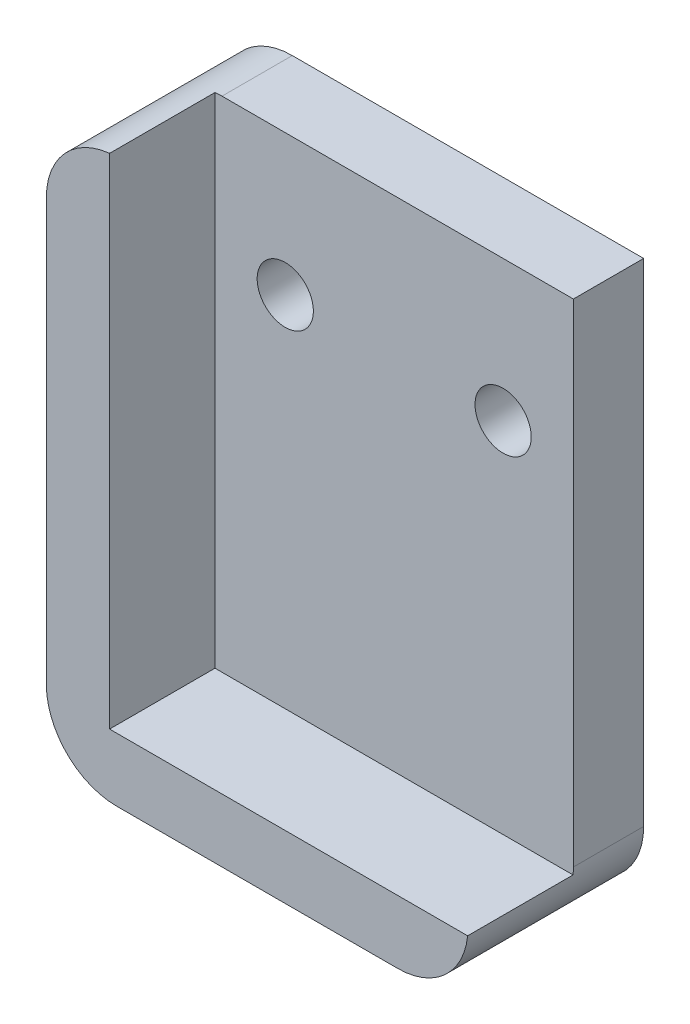
ISO-10303-21;
HEADER;
FILE_DESCRIPTION(('STEP AP214'),'2;1');
FILE_NAME('part.step','',(''),(''),'','','');
FILE_SCHEMA(('AUTOMOTIVE_DESIGN { 1 0 10303 214 1 1 1 1 }'));
ENDSEC;
DATA;
#1=APPLICATION_CONTEXT('core data for automotive mechanical design processes');
#2=APPLICATION_PROTOCOL_DEFINITION('international standard','automotive_design',2000,#1);
#3=PRODUCT_CONTEXT('',#1,'mechanical');
#4=PRODUCT('Part','Part','',(#3));
#5=PRODUCT_RELATED_PRODUCT_CATEGORY('part','',(#4));
#6=PRODUCT_DEFINITION_FORMATION('','',#4);
#7=PRODUCT_DEFINITION_CONTEXT('part definition',#1,'design');
#8=PRODUCT_DEFINITION('design','',#6,#7);
#9=PRODUCT_DEFINITION_SHAPE('','',#8);
#10=(LENGTH_UNIT() NAMED_UNIT(*) SI_UNIT(.MILLI.,.METRE.));
#11=(NAMED_UNIT(*) PLANE_ANGLE_UNIT() SI_UNIT($,.RADIAN.));
#12=(NAMED_UNIT(*) SI_UNIT($,.STERADIAN.) SOLID_ANGLE_UNIT());
#13=UNCERTAINTY_MEASURE_WITH_UNIT(LENGTH_MEASURE(1.E-05),#10,'distance_accuracy_value','');
#14=(GEOMETRIC_REPRESENTATION_CONTEXT(3) GLOBAL_UNCERTAINTY_ASSIGNED_CONTEXT((#13)) GLOBAL_UNIT_ASSIGNED_CONTEXT((#10,
#11,#12)) REPRESENTATION_CONTEXT('',''));
#15=CARTESIAN_POINT('',(0.,0.,0.));
#16=DIRECTION('',(0.,0.,1.));
#17=DIRECTION('',(1.,0.,0.));
#18=AXIS2_PLACEMENT_3D('',#15,#16,#17);
#19=CARTESIAN_POINT('',(60.,0.,10.));
#20=DIRECTION('',(1.,0.,0.));
#21=DIRECTION('',(0.,1.,0.));
#22=AXIS2_PLACEMENT_3D('',#19,#20,#21);
#23=PLANE('',#22);
#24=DIRECTION('',(0.,-1.,0.));
#25=VECTOR('',#24,1.);
#26=CARTESIAN_POINT('',(60.,0.,10.));
#27=LINE('',#26,#25);
#28=CARTESIAN_POINT('',(60.,80.,10.));
#29=VERTEX_POINT('',#28);
#30=CARTESIAN_POINT('',(60.,10.,10.));
#31=VERTEX_POINT('',#30);
#32=EDGE_CURVE('E153',#29,#31,#27,.T.);
#33=ORIENTED_EDGE('',*,*,#32,.T.);
#34=DIRECTION('',(0.,0.,-1.));
#35=VECTOR('',#34,1.);
#36=CARTESIAN_POINT('',(60.,10.,0.));
#37=LINE('',#36,#35);
#38=CARTESIAN_POINT('',(60.,10.,0.));
#39=VERTEX_POINT('',#38);
#40=EDGE_CURVE('E177',#31,#39,#37,.T.);
#41=ORIENTED_EDGE('',*,*,#40,.T.);
#42=DIRECTION('',(0.,-1.,0.));
#43=VECTOR('',#42,1.);
#44=CARTESIAN_POINT('',(60.,0.,0.));
#45=LINE('',#44,#43);
#46=CARTESIAN_POINT('',(60.,80.,0.));
#47=VERTEX_POINT('',#46);
#48=EDGE_CURVE('E152',#47,#39,#45,.T.);
#49=ORIENTED_EDGE('',*,*,#48,.F.);
#50=DIRECTION('',(0.,0.,-1.));
#51=VECTOR('',#50,1.);
#52=CARTESIAN_POINT('',(60.,80.,10.));
#53=LINE('',#52,#51);
#54=EDGE_CURVE('E159',#29,#47,#53,.T.);
#55=ORIENTED_EDGE('',*,*,#54,.F.);
#56=EDGE_LOOP('',(#33,#41,#49,#55));
#57=FACE_BOUND('',#56,.T.);
#58=ADVANCED_FACE('F39',(#57),#23,.T.);
#59=CARTESIAN_POINT('',(0.,80.,10.));
#60=DIRECTION('',(0.,1.,0.));
#61=DIRECTION('',(0.,0.,1.));
#62=AXIS2_PLACEMENT_3D('',#59,#60,#61);
#63=PLANE('',#62);
#64=DIRECTION('',(1.,0.,0.));
#65=VECTOR('',#64,1.);
#66=CARTESIAN_POINT('',(0.,80.,0.));
#67=LINE('',#66,#65);
#68=CARTESIAN_POINT('',(10.,80.,0.));
#69=VERTEX_POINT('',#68);
#70=EDGE_CURVE('E162',#69,#47,#67,.T.);
#71=ORIENTED_EDGE('',*,*,#70,.F.);
#72=DIRECTION('',(0.,0.,-1.));
#73=VECTOR('',#72,1.);
#74=CARTESIAN_POINT('',(10.,80.,10.));
#75=LINE('',#74,#73);
#76=CARTESIAN_POINT('',(10.,80.,10.));
#77=VERTEX_POINT('',#76);
#78=EDGE_CURVE('E47',#69,#77,#75,.F.);
#79=ORIENTED_EDGE('',*,*,#78,.T.);
#80=DIRECTION('',(1.,0.,0.));
#81=VECTOR('',#80,1.);
#82=CARTESIAN_POINT('',(0.,80.,10.));
#83=LINE('',#82,#81);
#84=EDGE_CURVE('E156',#77,#29,#83,.T.);
#85=ORIENTED_EDGE('',*,*,#84,.T.);
#86=ORIENTED_EDGE('',*,*,#54,.T.);
#87=EDGE_LOOP('',(#71,#79,#85,#86));
#88=FACE_BOUND('',#87,.T.);
#89=ADVANCED_FACE('F238',(#88),#63,.T.);
#90=CARTESIAN_POINT('',(0.,0.,10.));
#91=DIRECTION('',(-1.,0.,0.));
#92=DIRECTION('',(0.,0.,1.));
#93=AXIS2_PLACEMENT_3D('',#90,#91,#92);
#94=PLANE('',#93);
#95=DIRECTION('',(0.,1.,0.));
#96=VECTOR('',#95,1.);
#97=CARTESIAN_POINT('',(0.,0.,25.));
#98=LINE('',#97,#96);
#99=CARTESIAN_POINT('',(0.,10.,25.));
#100=VERTEX_POINT('',#99);
#101=CARTESIAN_POINT('',(0.,70.,25.));
#102=VERTEX_POINT('',#101);
#103=EDGE_CURVE('E124',#100,#102,#98,.T.);
#104=ORIENTED_EDGE('',*,*,#103,.T.);
#105=DIRECTION('',(0.,0.,-1.));
#106=VECTOR('',#105,1.);
#107=CARTESIAN_POINT('',(0.,70.,10.));
#108=LINE('',#107,#106);
#109=CARTESIAN_POINT('',(0.,70.,0.));
#110=VERTEX_POINT('',#109);
#111=EDGE_CURVE('E203',#102,#110,#108,.T.);
#112=ORIENTED_EDGE('',*,*,#111,.T.);
#113=DIRECTION('',(0.,1.,0.));
#114=VECTOR('',#113,1.);
#115=CARTESIAN_POINT('',(0.,0.,0.));
#116=LINE('',#115,#114);
#117=CARTESIAN_POINT('',(0.,10.,0.));
#118=VERTEX_POINT('',#117);
#119=EDGE_CURVE('E164',#118,#110,#116,.T.);
#120=ORIENTED_EDGE('',*,*,#119,.F.);
#121=DIRECTION('',(0.,0.,-1.));
#122=VECTOR('',#121,1.);
#123=CARTESIAN_POINT('',(0.,10.,25.));
#124=LINE('',#123,#122);
#125=EDGE_CURVE('E201',#118,#100,#124,.F.);
#126=ORIENTED_EDGE('',*,*,#125,.T.);
#127=EDGE_LOOP('',(#104,#112,#120,#126));
#128=FACE_BOUND('',#127,.T.);
#129=ADVANCED_FACE('F208',(#128),#94,.T.);
#130=CARTESIAN_POINT('',(0.,0.,10.));
#131=DIRECTION('',(0.,1.,0.));
#132=DIRECTION('',(0.,0.,1.));
#133=AXIS2_PLACEMENT_3D('',#130,#131,#132);
#134=PLANE('',#133);
#135=DIRECTION('',(1.,0.,0.));
#136=VECTOR('',#135,1.);
#137=CARTESIAN_POINT('',(0.,0.,0.));
#138=LINE('',#137,#136);
#139=CARTESIAN_POINT('',(10.,0.,0.));
#140=VERTEX_POINT('',#139);
#141=CARTESIAN_POINT('',(50.,0.,0.));
#142=VERTEX_POINT('',#141);
#143=EDGE_CURVE('E157',#140,#142,#138,.T.);
#144=ORIENTED_EDGE('',*,*,#143,.T.);
#145=DIRECTION('',(0.,0.,-1.));
#146=VECTOR('',#145,1.);
#147=CARTESIAN_POINT('',(50.,0.,25.));
#148=LINE('',#147,#146);
#149=CARTESIAN_POINT('',(50.,0.,25.));
#150=VERTEX_POINT('',#149);
#151=EDGE_CURVE('E189',#142,#150,#148,.F.);
#152=ORIENTED_EDGE('',*,*,#151,.T.);
#153=DIRECTION('',(1.,0.,0.));
#154=VECTOR('',#153,1.);
#155=CARTESIAN_POINT('',(0.,0.,25.));
#156=LINE('',#155,#154);
#157=CARTESIAN_POINT('',(10.,0.,25.));
#158=VERTEX_POINT('',#157);
#159=EDGE_CURVE('E134',#158,#150,#156,.T.);
#160=ORIENTED_EDGE('',*,*,#159,.F.);
#161=DIRECTION('',(0.,0.,-1.));
#162=VECTOR('',#161,1.);
#163=CARTESIAN_POINT('',(10.,0.,0.));
#164=LINE('',#163,#162);
#165=EDGE_CURVE('E186',#158,#140,#164,.T.);
#166=ORIENTED_EDGE('',*,*,#165,.T.);
#167=EDGE_LOOP('',(#144,#152,#160,#166));
#168=FACE_BOUND('',#167,.T.);
#169=ADVANCED_FACE('F221',(#168),#134,.F.);
#170=CARTESIAN_POINT('',(0.,0.,10.));
#171=DIRECTION('',(0.,0.,1.));
#172=DIRECTION('',(1.,0.,0.));
#173=AXIS2_PLACEMENT_3D('',#170,#171,#172);
#174=PLANE('',#173);
#175=CARTESIAN_POINT('',(50.,60.,10.));
#176=DIRECTION('',(0.,0.,1.));
#177=DIRECTION('',(1.,0.,0.));
#178=AXIS2_PLACEMENT_3D('',#175,#176,#177);
#179=CIRCLE('',#178,4.00000000000001);
#180=CARTESIAN_POINT('',(54.,60.,10.));
#181=VERTEX_POINT('',#180);
#182=EDGE_CURVE('E140',#181,#181,#179,.F.);
#183=ORIENTED_EDGE('',*,*,#182,.T.);
#184=EDGE_LOOP('',(#183));
#185=FACE_BOUND('',#184,.T.);
#186=CARTESIAN_POINT('',(19.,60.,10.));
#187=DIRECTION('',(0.,0.,1.));
#188=DIRECTION('',(1.,0.,0.));
#189=AXIS2_PLACEMENT_3D('',#186,#187,#188);
#190=CIRCLE('',#189,3.99999999999999);
#191=CARTESIAN_POINT('',(23.,60.,10.));
#192=VERTEX_POINT('',#191);
#193=EDGE_CURVE('E143',#192,#192,#190,.F.);
#194=ORIENTED_EDGE('',*,*,#193,.T.);
#195=EDGE_LOOP('',(#194));
#196=FACE_BOUND('',#195,.T.);
#197=DIRECTION('',(-1.,0.,0.));
#198=VECTOR('',#197,1.);
#199=CARTESIAN_POINT('',(0.,9.,10.));
#200=LINE('',#199,#198);
#201=CARTESIAN_POINT('',(59.9498743710662,9.,10.));
#202=VERTEX_POINT('',#201);
#203=CARTESIAN_POINT('',(9.,9.,10.));
#204=VERTEX_POINT('',#203);
#205=EDGE_CURVE('E132',#202,#204,#200,.T.);
#206=ORIENTED_EDGE('',*,*,#205,.F.);
#207=CARTESIAN_POINT('',(50.,10.,10.));
#208=DIRECTION('',(0.,0.,1.));
#209=DIRECTION('',(1.,0.,0.));
#210=AXIS2_PLACEMENT_3D('',#207,#208,#209);
#211=CIRCLE('',#210,10.);
#212=EDGE_CURVE('E199',#202,#31,#211,.T.);
#213=ORIENTED_EDGE('',*,*,#212,.T.);
#214=ORIENTED_EDGE('',*,*,#32,.F.);
#215=ORIENTED_EDGE('',*,*,#84,.F.);
#216=CARTESIAN_POINT('',(10.,70.,10.));
#217=DIRECTION('',(0.,0.,1.));
#218=DIRECTION('',(1.,0.,0.));
#219=AXIS2_PLACEMENT_3D('',#216,#217,#218);
#220=CIRCLE('',#219,10.);
#221=CARTESIAN_POINT('',(8.99999999999999,79.9498743710662,10.));
#222=VERTEX_POINT('',#221);
#223=EDGE_CURVE('E54',#77,#222,#220,.T.);
#224=ORIENTED_EDGE('',*,*,#223,.T.);
#225=DIRECTION('',(0.,1.,0.));
#226=VECTOR('',#225,1.);
#227=CARTESIAN_POINT('',(9.,0.,10.));
#228=LINE('',#227,#226);
#229=EDGE_CURVE('E133',#204,#222,#228,.T.);
#230=ORIENTED_EDGE('',*,*,#229,.F.);
#231=EDGE_LOOP('',(#206,#213,#214,#215,#224,#230));
#232=FACE_BOUND('',#231,.T.);
#233=ADVANCED_FACE('F227',(#185,#196,#232),#174,.T.);
#234=CARTESIAN_POINT('',(0.,0.,0.));
#235=DIRECTION('',(0.,0.,1.));
#236=DIRECTION('',(1.,0.,0.));
#237=AXIS2_PLACEMENT_3D('',#234,#235,#236);
#238=PLANE('',#237);
#239=ORIENTED_EDGE('',*,*,#48,.T.);
#240=CARTESIAN_POINT('',(50.,10.,0.));
#241=DIRECTION('',(0.,0.,1.));
#242=DIRECTION('',(1.,0.,0.));
#243=AXIS2_PLACEMENT_3D('',#240,#241,#242);
#244=CIRCLE('',#243,10.);
#245=EDGE_CURVE('E184',#39,#142,#244,.F.);
#246=ORIENTED_EDGE('',*,*,#245,.T.);
#247=ORIENTED_EDGE('',*,*,#143,.F.);
#248=CARTESIAN_POINT('',(10.,10.,0.));
#249=DIRECTION('',(0.,0.,1.));
#250=DIRECTION('',(1.,0.,0.));
#251=AXIS2_PLACEMENT_3D('',#248,#249,#250);
#252=CIRCLE('',#251,10.);
#253=EDGE_CURVE('E180',#140,#118,#252,.F.);
#254=ORIENTED_EDGE('',*,*,#253,.T.);
#255=ORIENTED_EDGE('',*,*,#119,.T.);
#256=CARTESIAN_POINT('',(10.,70.,0.));
#257=DIRECTION('',(0.,0.,1.));
#258=DIRECTION('',(1.,0.,0.));
#259=AXIS2_PLACEMENT_3D('',#256,#257,#258);
#260=CIRCLE('',#259,10.);
#261=EDGE_CURVE('E182',#110,#69,#260,.F.);
#262=ORIENTED_EDGE('',*,*,#261,.T.);
#263=ORIENTED_EDGE('',*,*,#70,.T.);
#264=EDGE_LOOP('',(#239,#246,#247,#254,#255,#262,#263));
#265=FACE_BOUND('',#264,.T.);
#266=CARTESIAN_POINT('',(50.,60.,0.));
#267=DIRECTION('',(0.,0.,1.));
#268=DIRECTION('',(1.,0.,0.));
#269=AXIS2_PLACEMENT_3D('',#266,#267,#268);
#270=CIRCLE('',#269,2.);
#271=CARTESIAN_POINT('',(52.,60.,0.));
#272=VERTEX_POINT('',#271);
#273=EDGE_CURVE('E296',#272,#272,#270,.T.);
#274=ORIENTED_EDGE('',*,*,#273,.T.);
#275=EDGE_LOOP('',(#274));
#276=FACE_BOUND('',#275,.T.);
#277=CARTESIAN_POINT('',(19.,60.,0.));
#278=DIRECTION('',(0.,0.,1.));
#279=DIRECTION('',(1.,0.,0.));
#280=AXIS2_PLACEMENT_3D('',#277,#278,#279);
#281=CIRCLE('',#280,2.00000000000001);
#282=CARTESIAN_POINT('',(21.,60.,0.));
#283=VERTEX_POINT('',#282);
#284=EDGE_CURVE('E301',#283,#283,#281,.T.);
#285=ORIENTED_EDGE('',*,*,#284,.T.);
#286=EDGE_LOOP('',(#285));
#287=FACE_BOUND('',#286,.T.);
#288=ADVANCED_FACE('F213',(#265,#276,#287),#238,.F.);
#289=CARTESIAN_POINT('',(0.,9.,25.));
#290=DIRECTION('',(0.,1.,0.));
#291=DIRECTION('',(0.,0.,1.));
#292=AXIS2_PLACEMENT_3D('',#289,#290,#291);
#293=PLANE('',#292);
#294=DIRECTION('',(1.,0.,0.));
#295=VECTOR('',#294,1.);
#296=CARTESIAN_POINT('',(0.,9.,25.));
#297=LINE('',#296,#295);
#298=CARTESIAN_POINT('',(9.,9.,25.));
#299=VERTEX_POINT('',#298);
#300=CARTESIAN_POINT('',(59.9498743710662,9.,25.));
#301=VERTEX_POINT('',#300);
#302=EDGE_CURVE('E125',#299,#301,#297,.T.);
#303=ORIENTED_EDGE('',*,*,#302,.T.);
#304=DIRECTION('',(0.,0.,1.));
#305=VECTOR('',#304,1.);
#306=CARTESIAN_POINT('',(59.9498743710662,9.,25.));
#307=LINE('',#306,#305);
#308=EDGE_CURVE('E196',#301,#202,#307,.F.);
#309=ORIENTED_EDGE('',*,*,#308,.T.);
#310=ORIENTED_EDGE('',*,*,#205,.T.);
#311=DIRECTION('',(0.,0.,-1.));
#312=VECTOR('',#311,1.);
#313=CARTESIAN_POINT('',(9.,9.,25.));
#314=LINE('',#313,#312);
#315=EDGE_CURVE('E119',#299,#204,#314,.T.);
#316=ORIENTED_EDGE('',*,*,#315,.F.);
#317=EDGE_LOOP('',(#303,#309,#310,#316));
#318=FACE_BOUND('',#317,.T.);
#319=ADVANCED_FACE('F129',(#318),#293,.T.);
#320=CARTESIAN_POINT('',(9.,0.,25.));
#321=DIRECTION('',(1.,0.,0.));
#322=DIRECTION('',(0.,1.,0.));
#323=AXIS2_PLACEMENT_3D('',#320,#321,#322);
#324=PLANE('',#323);
#325=ORIENTED_EDGE('',*,*,#229,.T.);
#326=DIRECTION('',(0.,0.,-1.));
#327=VECTOR('',#326,1.);
#328=CARTESIAN_POINT('',(8.99999999999999,79.9498743710662,10.));
#329=LINE('',#328,#327);
#330=CARTESIAN_POINT('',(8.99999999999999,79.9498743710662,25.));
#331=VERTEX_POINT('',#330);
#332=EDGE_CURVE('E11',#222,#331,#329,.F.);
#333=ORIENTED_EDGE('',*,*,#332,.T.);
#334=DIRECTION('',(0.,-1.,0.));
#335=VECTOR('',#334,1.);
#336=CARTESIAN_POINT('',(9.,0.,25.));
#337=LINE('',#336,#335);
#338=EDGE_CURVE('E116',#331,#299,#337,.T.);
#339=ORIENTED_EDGE('',*,*,#338,.T.);
#340=ORIENTED_EDGE('',*,*,#315,.T.);
#341=EDGE_LOOP('',(#325,#333,#339,#340));
#342=FACE_BOUND('',#341,.T.);
#343=ADVANCED_FACE('F118',(#342),#324,.T.);
#344=CARTESIAN_POINT('',(0.,0.,25.));
#345=DIRECTION('',(0.,0.,1.));
#346=DIRECTION('',(1.,0.,0.));
#347=AXIS2_PLACEMENT_3D('',#344,#345,#346);
#348=PLANE('',#347);
#349=ORIENTED_EDGE('',*,*,#159,.T.);
#350=CARTESIAN_POINT('',(50.,10.,25.));
#351=DIRECTION('',(0.,0.,1.));
#352=DIRECTION('',(1.,0.,0.));
#353=AXIS2_PLACEMENT_3D('',#350,#351,#352);
#354=CIRCLE('',#353,10.);
#355=EDGE_CURVE('E139',#150,#301,#354,.T.);
#356=ORIENTED_EDGE('',*,*,#355,.T.);
#357=ORIENTED_EDGE('',*,*,#302,.F.);
#358=ORIENTED_EDGE('',*,*,#338,.F.);
#359=CARTESIAN_POINT('',(10.,70.,25.));
#360=DIRECTION('',(0.,0.,1.));
#361=DIRECTION('',(1.,0.,0.));
#362=AXIS2_PLACEMENT_3D('',#359,#360,#361);
#363=CIRCLE('',#362,10.);
#364=EDGE_CURVE('E193',#331,#102,#363,.T.);
#365=ORIENTED_EDGE('',*,*,#364,.T.);
#366=ORIENTED_EDGE('',*,*,#103,.F.);
#367=CARTESIAN_POINT('',(10.,10.,25.));
#368=DIRECTION('',(0.,0.,1.));
#369=DIRECTION('',(1.,0.,0.));
#370=AXIS2_PLACEMENT_3D('',#367,#368,#369);
#371=CIRCLE('',#370,10.);
#372=EDGE_CURVE('E191',#100,#158,#371,.T.);
#373=ORIENTED_EDGE('',*,*,#372,.T.);
#374=EDGE_LOOP('',(#349,#356,#357,#358,#365,#366,#373));
#375=FACE_BOUND('',#374,.T.);
#376=ADVANCED_FACE('F137',(#375),#348,.T.);
#377=CARTESIAN_POINT('',(19.,60.,25.));
#378=DIRECTION('',(0.,0.,-1.));
#379=DIRECTION('',(-1.,0.,0.));
#380=AXIS2_PLACEMENT_3D('',#377,#378,#379);
#381=CYLINDRICAL_SURFACE('',#380,3.99999999999999);
#382=CARTESIAN_POINT('',(19.,60.,4.));
#383=DIRECTION('',(0.,0.,1.));
#384=DIRECTION('',(1.,0.,0.));
#385=AXIS2_PLACEMENT_3D('',#382,#383,#384);
#386=CIRCLE('',#385,3.99999999999999);
#387=CARTESIAN_POINT('',(23.,60.,4.));
#388=VERTEX_POINT('',#387);
#389=EDGE_CURVE('E174',#388,#388,#386,.T.);
#390=ORIENTED_EDGE('',*,*,#389,.F.);
#391=EDGE_LOOP('',(#390));
#392=FACE_BOUND('',#391,.T.);
#393=ORIENTED_EDGE('',*,*,#193,.F.);
#394=EDGE_LOOP('',(#393));
#395=FACE_BOUND('',#394,.T.);
#396=ADVANCED_FACE('F261',(#392,#395),#381,.F.);
#397=CARTESIAN_POINT('',(50.,60.,25.));
#398=DIRECTION('',(0.,0.,-1.));
#399=DIRECTION('',(-1.,0.,0.));
#400=AXIS2_PLACEMENT_3D('',#397,#398,#399);
#401=CYLINDRICAL_SURFACE('',#400,4.00000000000001);
#402=CARTESIAN_POINT('',(50.,60.,4.));
#403=DIRECTION('',(0.,0.,1.));
#404=DIRECTION('',(1.,0.,0.));
#405=AXIS2_PLACEMENT_3D('',#402,#403,#404);
#406=CIRCLE('',#405,4.00000000000001);
#407=CARTESIAN_POINT('',(54.,60.,4.));
#408=VERTEX_POINT('',#407);
#409=EDGE_CURVE('E171',#408,#408,#406,.T.);
#410=ORIENTED_EDGE('',*,*,#409,.F.);
#411=EDGE_LOOP('',(#410));
#412=FACE_BOUND('',#411,.T.);
#413=ORIENTED_EDGE('',*,*,#182,.F.);
#414=EDGE_LOOP('',(#413));
#415=FACE_BOUND('',#414,.T.);
#416=ADVANCED_FACE('F264',(#412,#415),#401,.F.);
#417=CARTESIAN_POINT('',(50.,60.,4.));
#418=DIRECTION('',(0.,0.,-1.));
#419=DIRECTION('',(-1.,0.,0.));
#420=AXIS2_PLACEMENT_3D('',#417,#418,#419);
#421=CYLINDRICAL_SURFACE('',#420,2.);
#422=CARTESIAN_POINT('',(50.,60.,4.));
#423=DIRECTION('',(0.,0.,1.));
#424=DIRECTION('',(1.,0.,0.));
#425=AXIS2_PLACEMENT_3D('',#422,#423,#424);
#426=CIRCLE('',#425,2.);
#427=CARTESIAN_POINT('',(52.,60.,4.));
#428=VERTEX_POINT('',#427);
#429=EDGE_CURVE('E294',#428,#428,#426,.T.);
#430=ORIENTED_EDGE('',*,*,#429,.T.);
#431=EDGE_LOOP('',(#430));
#432=FACE_BOUND('',#431,.T.);
#433=ORIENTED_EDGE('',*,*,#273,.F.);
#434=EDGE_LOOP('',(#433));
#435=FACE_BOUND('',#434,.T.);
#436=ADVANCED_FACE('F268',(#432,#435),#421,.F.);
#437=CARTESIAN_POINT('',(0.,0.,4.));
#438=DIRECTION('',(0.,0.,1.));
#439=DIRECTION('',(1.,0.,0.));
#440=AXIS2_PLACEMENT_3D('',#437,#438,#439);
#441=PLANE('',#440);
#442=ORIENTED_EDGE('',*,*,#429,.F.);
#443=EDGE_LOOP('',(#442));
#444=FACE_BOUND('',#443,.T.);
#445=ORIENTED_EDGE('',*,*,#409,.T.);
#446=EDGE_LOOP('',(#445));
#447=FACE_BOUND('',#446,.T.);
#448=ADVANCED_FACE('F272',(#444,#447),#441,.T.);
#449=CARTESIAN_POINT('',(19.,60.,4.));
#450=DIRECTION('',(0.,0.,-1.));
#451=DIRECTION('',(-1.,0.,0.));
#452=AXIS2_PLACEMENT_3D('',#449,#450,#451);
#453=CYLINDRICAL_SURFACE('',#452,2.00000000000001);
#454=CARTESIAN_POINT('',(19.,60.,4.));
#455=DIRECTION('',(0.,0.,1.));
#456=DIRECTION('',(1.,0.,0.));
#457=AXIS2_PLACEMENT_3D('',#454,#455,#456);
#458=CIRCLE('',#457,2.00000000000001);
#459=CARTESIAN_POINT('',(21.,60.,4.));
#460=VERTEX_POINT('',#459);
#461=EDGE_CURVE('E288',#460,#460,#458,.T.);
#462=ORIENTED_EDGE('',*,*,#461,.T.);
#463=EDGE_LOOP('',(#462));
#464=FACE_BOUND('',#463,.T.);
#465=ORIENTED_EDGE('',*,*,#284,.F.);
#466=EDGE_LOOP('',(#465));
#467=FACE_BOUND('',#466,.T.);
#468=ADVANCED_FACE('F276',(#464,#467),#453,.F.);
#469=CARTESIAN_POINT('',(0.,0.,4.));
#470=DIRECTION('',(0.,0.,1.));
#471=DIRECTION('',(1.,0.,0.));
#472=AXIS2_PLACEMENT_3D('',#469,#470,#471);
#473=PLANE('',#472);
#474=ORIENTED_EDGE('',*,*,#461,.F.);
#475=EDGE_LOOP('',(#474));
#476=FACE_BOUND('',#475,.T.);
#477=ORIENTED_EDGE('',*,*,#389,.T.);
#478=EDGE_LOOP('',(#477));
#479=FACE_BOUND('',#478,.T.);
#480=ADVANCED_FACE('F235',(#476,#479),#473,.T.);
#481=CARTESIAN_POINT('',(50.,10.,10.));
#482=DIRECTION('',(0.,0.,1.));
#483=DIRECTION('',(1.,0.,0.));
#484=AXIS2_PLACEMENT_3D('',#481,#482,#483);
#485=CYLINDRICAL_SURFACE('',#484,10.);
#486=ORIENTED_EDGE('',*,*,#355,.F.);
#487=ORIENTED_EDGE('',*,*,#151,.F.);
#488=ORIENTED_EDGE('',*,*,#245,.F.);
#489=ORIENTED_EDGE('',*,*,#40,.F.);
#490=ORIENTED_EDGE('',*,*,#212,.F.);
#491=ORIENTED_EDGE('',*,*,#308,.F.);
#492=EDGE_LOOP('',(#486,#487,#488,#489,#490,#491));
#493=FACE_BOUND('',#492,.T.);
#494=ADVANCED_FACE('F224',(#493),#485,.T.);
#495=CARTESIAN_POINT('',(10.,70.,10.));
#496=DIRECTION('',(0.,0.,-1.));
#497=DIRECTION('',(-1.,0.,0.));
#498=AXIS2_PLACEMENT_3D('',#495,#496,#497);
#499=CYLINDRICAL_SURFACE('',#498,10.);
#500=ORIENTED_EDGE('',*,*,#223,.F.);
#501=ORIENTED_EDGE('',*,*,#78,.F.);
#502=ORIENTED_EDGE('',*,*,#261,.F.);
#503=ORIENTED_EDGE('',*,*,#111,.F.);
#504=ORIENTED_EDGE('',*,*,#364,.F.);
#505=ORIENTED_EDGE('',*,*,#332,.F.);
#506=EDGE_LOOP('',(#500,#501,#502,#503,#504,#505));
#507=FACE_BOUND('',#506,.T.);
#508=ADVANCED_FACE('F229',(#507),#499,.T.);
#509=CARTESIAN_POINT('',(10.,10.,10.));
#510=DIRECTION('',(0.,0.,1.));
#511=DIRECTION('',(1.,0.,0.));
#512=AXIS2_PLACEMENT_3D('',#509,#510,#511);
#513=CYLINDRICAL_SURFACE('',#512,10.);
#514=ORIENTED_EDGE('',*,*,#372,.F.);
#515=ORIENTED_EDGE('',*,*,#125,.F.);
#516=ORIENTED_EDGE('',*,*,#253,.F.);
#517=ORIENTED_EDGE('',*,*,#165,.F.);
#518=EDGE_LOOP('',(#514,#515,#516,#517));
#519=FACE_BOUND('',#518,.T.);
#520=ADVANCED_FACE('F41',(#519),#513,.T.);
#521=CLOSED_SHELL('',(#58,#89,#129,#169,#233,#288,#319,#343,#376,#396,#416,#436,#448,#468,#480,
#494,#508,#520));
#522=MANIFOLD_SOLID_BREP('B2',#521);
#523=ADVANCED_BREP_SHAPE_REPRESENTATION('',(#18,#522),#14);
#524=SHAPE_DEFINITION_REPRESENTATION(#9,#523);
ENDSEC;
END-ISO-10303-21;
